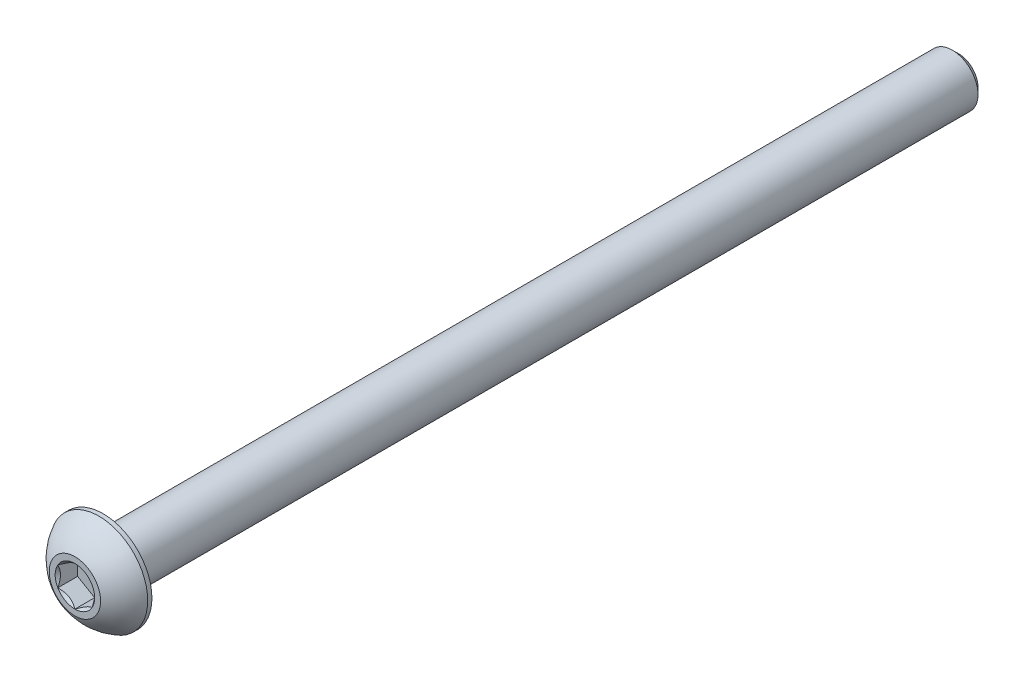
ISO-10303-21;
HEADER;
FILE_DESCRIPTION(('STEP AP214'),'2;1');
FILE_NAME('part.step','',(''),(''),'','','');
FILE_SCHEMA(('AUTOMOTIVE_DESIGN { 1 0 10303 214 1 1 1 1 }'));
ENDSEC;
DATA;
#1=APPLICATION_CONTEXT('core data for automotive mechanical design processes');
#2=APPLICATION_PROTOCOL_DEFINITION('international standard','automotive_design',2000,#1);
#3=PRODUCT_CONTEXT('',#1,'mechanical');
#4=PRODUCT('Part','Part','',(#3));
#5=PRODUCT_RELATED_PRODUCT_CATEGORY('part','',(#4));
#6=PRODUCT_DEFINITION_FORMATION('','',#4);
#7=PRODUCT_DEFINITION_CONTEXT('part definition',#1,'design');
#8=PRODUCT_DEFINITION('design','',#6,#7);
#9=PRODUCT_DEFINITION_SHAPE('','',#8);
#10=(LENGTH_UNIT() NAMED_UNIT(*) SI_UNIT(.MILLI.,.METRE.));
#11=(NAMED_UNIT(*) PLANE_ANGLE_UNIT() SI_UNIT($,.RADIAN.));
#12=(NAMED_UNIT(*) SI_UNIT($,.STERADIAN.) SOLID_ANGLE_UNIT());
#13=UNCERTAINTY_MEASURE_WITH_UNIT(LENGTH_MEASURE(1.E-05),#10,'distance_accuracy_value','');
#14=(GEOMETRIC_REPRESENTATION_CONTEXT(3) GLOBAL_UNCERTAINTY_ASSIGNED_CONTEXT((#13)) GLOBAL_UNIT_ASSIGNED_CONTEXT((#10,
#11,#12)) REPRESENTATION_CONTEXT('',''));
#15=CARTESIAN_POINT('',(0.,0.,0.));
#16=DIRECTION('',(0.,0.,1.));
#17=DIRECTION('',(1.,0.,0.));
#18=AXIS2_PLACEMENT_3D('',#15,#16,#17);
#19=CARTESIAN_POINT('',(0.,0.,-51.65));
#20=DIRECTION('',(0.,0.,1.));
#21=DIRECTION('',(1.,0.,0.));
#22=AXIS2_PLACEMENT_3D('',#19,#20,#21);
#23=PLANE('',#22);
#24=CARTESIAN_POINT('',(0.,0.,-51.65));
#25=DIRECTION('',(0.,0.,1.));
#26=DIRECTION('',(1.,0.,0.));
#27=AXIS2_PLACEMENT_3D('',#24,#25,#26);
#28=CIRCLE('',#27,1.12500000000003);
#29=CARTESIAN_POINT('',(1.12500000000003,0.,-51.65));
#30=VERTEX_POINT('',#29);
#31=EDGE_CURVE('E55',#30,#30,#28,.T.);
#32=ORIENTED_EDGE('',*,*,#31,.F.);
#33=EDGE_LOOP('',(#32));
#34=FACE_BOUND('',#33,.T.);
#35=ADVANCED_FACE('F41',(#34),#23,.F.);
#36=CARTESIAN_POINT('',(0.,0.,-51.65));
#37=DIRECTION('',(0.,0.,1.));
#38=DIRECTION('',(1.,0.,0.));
#39=AXIS2_PLACEMENT_3D('',#36,#37,#38);
#40=CONICAL_SURFACE('',#39,1.12500000000003,0.785398163397431);
#41=CARTESIAN_POINT('',(0.,0.,-51.275));
#42=DIRECTION('',(0.,0.,1.));
#43=DIRECTION('',(1.,0.,0.));
#44=AXIS2_PLACEMENT_3D('',#41,#42,#43);
#45=CIRCLE('',#44,1.50000000000002);
#46=CARTESIAN_POINT('',(1.50000000000002,0.,-51.275));
#47=VERTEX_POINT('',#46);
#48=EDGE_CURVE('E198',#47,#47,#45,.T.);
#49=ORIENTED_EDGE('',*,*,#48,.F.);
#50=EDGE_LOOP('',(#49));
#51=FACE_BOUND('',#50,.T.);
#52=ORIENTED_EDGE('',*,*,#31,.T.);
#53=EDGE_LOOP('',(#52));
#54=FACE_BOUND('',#53,.T.);
#55=ADVANCED_FACE('F205',(#51,#54),#40,.T.);
#56=CARTESIAN_POINT('',(0.,0.,0.));
#57=DIRECTION('',(0.,0.,1.));
#58=DIRECTION('',(1.,0.,0.));
#59=AXIS2_PLACEMENT_3D('',#56,#57,#58);
#60=CYLINDRICAL_SURFACE('',#59,1.50000000000002);
#61=CARTESIAN_POINT('',(0.,0.,-1.65));
#62=DIRECTION('',(0.,0.,1.));
#63=DIRECTION('',(1.,0.,0.));
#64=AXIS2_PLACEMENT_3D('',#61,#62,#63);
#65=CIRCLE('',#64,1.50000000000002);
#66=CARTESIAN_POINT('',(1.50000000000002,0.,-1.65));
#67=VERTEX_POINT('',#66);
#68=EDGE_CURVE('E194',#67,#67,#65,.T.);
#69=ORIENTED_EDGE('',*,*,#68,.F.);
#70=EDGE_LOOP('',(#69));
#71=FACE_BOUND('',#70,.T.);
#72=ORIENTED_EDGE('',*,*,#48,.T.);
#73=EDGE_LOOP('',(#72));
#74=FACE_BOUND('',#73,.T.);
#75=ADVANCED_FACE('F211',(#71,#74),#60,.T.);
#76=CARTESIAN_POINT('',(0.,-2.85,-1.65));
#77=DIRECTION('',(0.,0.,1.));
#78=DIRECTION('',(1.,0.,0.));
#79=AXIS2_PLACEMENT_3D('',#76,#77,#78);
#80=PLANE('',#79);
#81=CARTESIAN_POINT('',(0.,0.,-1.65));
#82=DIRECTION('',(0.,0.,1.));
#83=DIRECTION('',(1.,0.,0.));
#84=AXIS2_PLACEMENT_3D('',#81,#82,#83);
#85=CIRCLE('',#84,2.85);
#86=CARTESIAN_POINT('',(2.85,0.,-1.65));
#87=VERTEX_POINT('',#86);
#88=EDGE_CURVE('E186',#87,#87,#85,.T.);
#89=ORIENTED_EDGE('',*,*,#88,.F.);
#90=EDGE_LOOP('',(#89));
#91=FACE_BOUND('',#90,.T.);
#92=ORIENTED_EDGE('',*,*,#68,.T.);
#93=EDGE_LOOP('',(#92));
#94=FACE_BOUND('',#93,.T.);
#95=ADVANCED_FACE('F216',(#91,#94),#80,.F.);
#96=CARTESIAN_POINT('',(0.,0.,-2.79483288770053));
#97=DIRECTION('',(0.,0.,1.));
#98=DIRECTION('',(0.,-1.,0.));
#99=AXIS2_PLACEMENT_3D('',#96,#97,#98);
#100=SPHERICAL_SURFACE('',#99,3.17192226735975);
#101=CARTESIAN_POINT('',(0.,0.,0.));
#102=DIRECTION('',(0.,0.,1.));
#103=DIRECTION('',(1.,0.,0.));
#104=AXIS2_PLACEMENT_3D('',#101,#102,#103);
#105=CIRCLE('',#104,1.50000000000002);
#106=CARTESIAN_POINT('',(0.,-1.50000000000002,0.));
#107=VERTEX_POINT('',#106);
#108=EDGE_CURVE('E190',#107,#107,#105,.T.);
#109=CARTESIAN_POINT('',(0.,0.,-1.4025));
#110=DIRECTION('',(0.,0.,1.));
#111=DIRECTION('',(1.,0.,0.));
#112=AXIS2_PLACEMENT_3D('',#109,#110,#111);
#113=CIRCLE('',#112,2.85);
#114=CARTESIAN_POINT('',(0.,-2.85,-1.4025));
#115=VERTEX_POINT('',#114);
#116=EDGE_CURVE('E182',#115,#115,#113,.T.);
#117=CARTESIAN_POINT('',(0.,-1.50000000000002,0.));
#118=CARTESIAN_POINT('',(0.,-1.51816007989212,-0.009746569473365));
#119=CARTESIAN_POINT('',(0.,-1.53622513742982,-0.0196701847238474));
#120=CARTESIAN_POINT('',(0.,-1.57215840256596,-0.039867631129312));
#121=CARTESIAN_POINT('',(0.,-1.59002661016439,-0.0501414622842942));
#122=CARTESIAN_POINT('',(0.,-1.62555937019151,-0.0710354648490238));
#123=CARTESIAN_POINT('',(0.,-1.64322392262021,-0.0816556362587711));
#124=CARTESIAN_POINT('',(0.,-1.67834266450263,-0.103238276426968));
#125=CARTESIAN_POINT('',(0.,-1.69579685395637,-0.114200745185417));
#126=CARTESIAN_POINT('',(0.,-1.73048823664555,-0.136463816635607));
#127=CARTESIAN_POINT('',(0.,-1.747725429881,-0.147764419327348));
#128=CARTESIAN_POINT('',(0.,-1.78197627078177,-0.170699464187154));
#129=CARTESIAN_POINT('',(0.,-1.7989899184471,-0.18233390635522));
#130=CARTESIAN_POINT('',(0.,-1.83278720341136,-0.205932209546913));
#131=CARTESIAN_POINT('',(0.,-1.84957084071029,-0.217896070570541));
#132=CARTESIAN_POINT('',(0.,-1.88290172764637,-0.242148665498755));
#133=CARTESIAN_POINT('',(0.,-1.89944897728351,-0.254437399403342));
#134=CARTESIAN_POINT('',(0.,-1.9323008013937,-0.279335070725424));
#135=CARTESIAN_POINT('',(0.,-1.94860537586674,-0.291944008142921));
#136=CARTESIAN_POINT('',(0.,-1.98096565436366,-0.317477295441113));
#137=CARTESIAN_POINT('',(0.,-1.99702135838754,-0.330401645321808));
#138=CARTESIAN_POINT('',(0.,-2.02887779526297,-0.356560846652227));
#139=CARTESIAN_POINT('',(0.,-2.04467852811453,-0.36979569810195));
#140=CARTESIAN_POINT('',(0.,-2.07601901880465,-0.396570873693308));
#141=CARTESIAN_POINT('',(0.,-2.09155877664322,-0.410111197834944));
#142=CARTESIAN_POINT('',(0.,-2.12237141262986,-0.437492173862107));
#143=CARTESIAN_POINT('',(0.,-2.13764429077792,-0.451332825747635));
#144=CARTESIAN_POINT('',(0.,-2.16791736411296,-0.479309198198269));
#145=CARTESIAN_POINT('',(0.,-2.18291755929994,-0.493444918763376));
#146=CARTESIAN_POINT('',(0.,-2.21263956705415,-0.522006057390952));
#147=CARTESIAN_POINT('',(0.,-2.2273613796214,-0.53643147545342));
#148=CARTESIAN_POINT('',(0.,-2.25652102825521,-0.565566527816472));
#149=CARTESIAN_POINT('',(0.,-2.27095886432178,-0.580276162117056));
#150=CARTESIAN_POINT('',(0.,-2.2995450739765,-0.609974057702796));
#151=CARTESIAN_POINT('',(0.,-2.31369344756466,-0.624962318987953));
#152=CARTESIAN_POINT('',(0.,-2.34169535627252,-0.65521177341876));
#153=CARTESIAN_POINT('',(0.,-2.35554889139224,-0.670472966564411));
#154=CARTESIAN_POINT('',(0.,-2.38295585920366,-0.701262485885584));
#155=CARTESIAN_POINT('',(0.,-2.39650929189537,-0.716790812061106));
#156=CARTESIAN_POINT('',(0.,-2.42331090492182,-0.748108697108243));
#157=CARTESIAN_POINT('',(0.,-2.43655908525657,-0.763898255979859));
#158=CARTESIAN_POINT('',(0.,-2.46274515962755,-0.795732606824228));
#159=CARTESIAN_POINT('',(0.,-2.47568305366379,-0.811777398796981));
#160=CARTESIAN_POINT('',(0.,-2.50124363939651,-0.844116119267127));
#161=CARTESIAN_POINT('',(0.,-2.51386633109298,-0.86041004776452));
#162=CARTESIAN_POINT('',(0.,-2.53879171587279,-0.8932408500426));
#163=CARTESIAN_POINT('',(0.,-2.55109440895612,-0.909777723823287));
#164=CARTESIAN_POINT('',(0.,-2.57537512182785,-0.94308813311364));
#165=CARTESIAN_POINT('',(0.,-2.58735314161625,-0.959861668623306));
#166=CARTESIAN_POINT('',(0.,-2.61097995657956,-0.993639027894247));
#167=CARTESIAN_POINT('',(0.,-2.62262875175448,-1.01064285165552));
#168=CARTESIAN_POINT('',(0.,-2.64559269128199,-1.04487432644225));
#169=CARTESIAN_POINT('',(0.,-2.65690783563458,-1.06210197746771));
#170=CARTESIAN_POINT('',(0.,-2.67920017403639,-1.09677456077299));
#171=CARTESIAN_POINT('',(0.,-2.69017736808561,-1.11421949305282));
#172=CARTESIAN_POINT('',(0.,-2.711789634999,-1.14932001019995));
#173=CARTESIAN_POINT('',(0.,-2.72242470786316,-1.16697559506725));
#174=CARTESIAN_POINT('',(0.,-2.74334869082118,-1.20249070903943));
#175=CARTESIAN_POINT('',(0.,-2.75363760091502,-1.22035023814429));
#176=CARTESIAN_POINT('',(0.,-2.77386535089241,-1.25626645340824));
#177=CARTESIAN_POINT('',(0.,-2.78380419077596,-1.27432313956732));
#178=CARTESIAN_POINT('',(0.,-2.80332801615778,-1.31062681184411));
#179=CARTESIAN_POINT('',(0.,-2.81291300165605,-1.32887379796182));
#180=CARTESIAN_POINT('',(0.,-2.83172550494215,-1.3655511220839));
#181=CARTESIAN_POINT('',(0.,-2.84095302272998,-1.38398146008827));
#182=CARTESIAN_POINT('',(0.,-2.85,-1.4025));
#183=B_SPLINE_CURVE_WITH_KNOTS('',3,(#117,#118,#119,#120,#121,#122,#123,#124,#125,#126,#127,
#128,#129,#130,#131,#132,#133,#134,#135,#136,#137,#138,#139,#140,#141,#142,#143,#144,#145,#146,
#147,#148,#149,#150,#151,#152,#153,#154,#155,#156,#157,#158,#159,#160,#161,#162,#163,#164,#165,
#166,#167,#168,#169,#170,#171,#172,#173,#174,#175,#176,#177,#178,#179,#180,#181,#182),
.UNSPECIFIED.,.F.,.F.,(4,2,2,2,2,2,2,2,2,2,2,2,2,2,2,2,2,2,2,2,2,2,2,2,2,2,2,2,2,2,2,2,4),(0.,
0.061829894182698,0.123659788365395,0.185489682548094,0.247319576730792,0.30914947091349,
0.370979365096188,0.432809259278885,0.494639153461583,0.556469047644282,0.618298941826979,
0.680128836009677,0.741958730192375,0.803788624375073,0.865618518557771,0.927448412740469,
0.989278306923166,1.05110820110586,1.11293809528856,1.17476798947126,1.23659788365396,
1.29842777783666,1.36025767201935,1.42208756620205,1.48391746038475,1.54574735456745,
1.60757724875015,1.66940714293284,1.73123703711554,1.79306693129824,1.85489682548094,
1.91672671966364,1.97855661384633),.UNSPECIFIED.);
#184=EDGE_CURVE('BSEAM221',#107,#115,#183,.T.);
#185=ORIENTED_EDGE('',*,*,#108,.F.);
#186=ORIENTED_EDGE('',*,*,#116,.T.);
#187=ORIENTED_EDGE('',*,*,#184,.T.);
#188=ORIENTED_EDGE('',*,*,#184,.F.);
#189=EDGE_LOOP('',(#185,#187,#186,#188));
#190=FACE_BOUND('',#189,.T.);
#191=ADVANCED_FACE('F221',(#190),#100,.T.);
#192=CARTESIAN_POINT('',(0.,-1.50000000000002,0.));
#193=DIRECTION('',(0.,0.,-1.));
#194=DIRECTION('',(-1.,0.,0.));
#195=AXIS2_PLACEMENT_3D('',#192,#193,#194);
#196=PLANE('',#195);
#197=CARTESIAN_POINT('',(0.,0.,0.));
#198=DIRECTION('',(0.,0.,1.));
#199=DIRECTION('',(1.,0.,0.));
#200=AXIS2_PLACEMENT_3D('',#197,#198,#199);
#201=CIRCLE('',#200,1.15470053837925);
#202=CARTESIAN_POINT('',(-0.999999999999997,0.577350269189625,0.));
#203=VERTEX_POINT('',#202);
#204=CARTESIAN_POINT('',(-0.999999999999997,-0.577350269189627,0.));
#205=VERTEX_POINT('',#204);
#206=EDGE_CURVE('E68',#203,#205,#201,.T.);
#207=ORIENTED_EDGE('',*,*,#206,.F.);
#208=CARTESIAN_POINT('',(0.,1.15470053837925,0.));
#209=VERTEX_POINT('',#208);
#210=EDGE_CURVE('E145',#209,#203,#201,.T.);
#211=ORIENTED_EDGE('',*,*,#210,.F.);
#212=CARTESIAN_POINT('',(1.,0.57735026918962,0.));
#213=VERTEX_POINT('',#212);
#214=EDGE_CURVE('E140',#213,#209,#201,.T.);
#215=ORIENTED_EDGE('',*,*,#214,.F.);
#216=CARTESIAN_POINT('',(1.,-0.577350269189621,0.));
#217=VERTEX_POINT('',#216);
#218=EDGE_CURVE('E109',#217,#213,#201,.T.);
#219=ORIENTED_EDGE('',*,*,#218,.F.);
#220=CARTESIAN_POINT('',(0.,-1.15470053837925,0.));
#221=VERTEX_POINT('',#220);
#222=EDGE_CURVE('E100',#221,#217,#201,.T.);
#223=ORIENTED_EDGE('',*,*,#222,.F.);
#224=EDGE_CURVE('E61',#205,#221,#201,.T.);
#225=ORIENTED_EDGE('',*,*,#224,.F.);
#226=EDGE_LOOP('',(#207,#211,#215,#219,#223,#225));
#227=FACE_BOUND('',#226,.T.);
#228=ORIENTED_EDGE('',*,*,#108,.T.);
#229=EDGE_LOOP('',(#228));
#230=FACE_BOUND('',#229,.T.);
#231=ADVANCED_FACE('F137',(#227,#230),#196,.F.);
#232=CARTESIAN_POINT('',(0.,0.,0.));
#233=DIRECTION('',(0.,0.,1.));
#234=DIRECTION('',(1.,0.,0.));
#235=AXIS2_PLACEMENT_3D('',#232,#233,#234);
#236=CYLINDRICAL_SURFACE('',#235,2.85);
#237=ORIENTED_EDGE('',*,*,#116,.F.);
#238=EDGE_LOOP('',(#237));
#239=FACE_BOUND('',#238,.T.);
#240=ORIENTED_EDGE('',*,*,#88,.T.);
#241=EDGE_LOOP('',(#240));
#242=FACE_BOUND('',#241,.T.);
#243=ADVANCED_FACE('F227',(#239,#242),#236,.T.);
#244=CARTESIAN_POINT('',(0.,0.,0.));
#245=DIRECTION('',(0.,0.,1.));
#246=DIRECTION('',(1.,0.,0.));
#247=AXIS2_PLACEMENT_3D('',#244,#245,#246);
#248=CONICAL_SURFACE('',#247,1.15470053837925,0.78539816339745);
#249=ORIENTED_EDGE('',*,*,#218,.T.);
#250=CARTESIAN_POINT('',(1.,-1.15147208646461,0.370385677513857));
#251=CARTESIAN_POINT('',(1.,-1.12343447988551,0.349219919873708));
#252=CARTESIAN_POINT('',(1.,-1.09524064850696,0.328261692175906));
#253=CARTESIAN_POINT('',(1.,-1.03847715644375,0.286846022235618));
#254=CARTESIAN_POINT('',(1.,-1.00990740382974,0.266388706123655));
#255=CARTESIAN_POINT('',(1.,-0.92312089433347,0.205604794954506));
#256=CARTESIAN_POINT('',(1.,-0.864253173759053,0.166192228961395));
#257=CARTESIAN_POINT('',(1.,-0.74080985825804,0.0888206642002037));
#258=CARTESIAN_POINT('',(1.,-0.676100255137802,0.0510730391143415));
#259=CARTESIAN_POINT('',(1.,-0.54344893904912,-0.0179754124487081));
#260=CARTESIAN_POINT('',(1.,-0.475519112027775,-0.049297972153134));
#261=CARTESIAN_POINT('',(1.,-0.373555850333526,-0.0876182211162039));
#262=CARTESIAN_POINT('',(1.,-0.341031989670905,-0.0986164083578424));
#263=CARTESIAN_POINT('',(1.,-0.275199079052291,-0.118001657852638));
#264=CARTESIAN_POINT('',(1.,-0.24188997517393,-0.126388540223299));
#265=CARTESIAN_POINT('',(1.,-0.17524751704299,-0.139974779280982));
#266=CARTESIAN_POINT('',(1.,-0.141925568218173,-0.145229209232031));
#267=CARTESIAN_POINT('',(1.,-0.0749144362322771,-0.152451313429106));
#268=CARTESIAN_POINT('',(1.,-0.0412251978501601,-0.15441848638949));
#269=CARTESIAN_POINT('',(1.,0.0249580992634224,-0.154916801606837));
#270=CARTESIAN_POINT('',(1.,0.0574512826460405,-0.153569732111363));
#271=CARTESIAN_POINT('',(1.,0.122148505701868,-0.147783515501013));
#272=CARTESIAN_POINT('',(1.,0.154352610132927,-0.143345079338462));
#273=CARTESIAN_POINT('',(1.,0.21879989886764,-0.131543169854794));
#274=CARTESIAN_POINT('',(1.,0.251033743268954,-0.124129458961488));
#275=CARTESIAN_POINT('',(1.,0.314797132354919,-0.106771057501322));
#276=CARTESIAN_POINT('',(1.,0.346326735731005,-0.0968265787111677));
#277=CARTESIAN_POINT('',(1.,0.445594187730205,-0.0617765174456608));
#278=CARTESIAN_POINT('',(1.,0.511919139476036,-0.0326791416432731));
#279=CARTESIAN_POINT('',(1.,0.641453244657532,0.0320153296865072));
#280=CARTESIAN_POINT('',(1.,0.704650133126345,0.0676357767152442));
#281=CARTESIAN_POINT('',(1.,0.825428490174987,0.141123901346938));
#282=CARTESIAN_POINT('',(1.,0.883132947867685,0.178791947135466));
#283=CARTESIAN_POINT('',(1.,0.968148853704565,0.237022852943166));
#284=CARTESIAN_POINT('',(1.,0.996120570380285,0.256638475762859));
#285=CARTESIAN_POINT('',(1.,1.05168177729901,0.296388517061273));
#286=CARTESIAN_POINT('',(1.,1.079271369977,0.316522792198834));
#287=CARTESIAN_POINT('',(1.,1.10670185346329,0.336872119072974));
#288=B_SPLINE_CURVE_WITH_KNOTS('',3,(#250,#251,#252,#253,#254,#255,#256,#257,#258,#259,#260,
#261,#262,#263,#264,#265,#266,#267,#268,#269,#270,#271,#272,#273,#274,#275,#276,#277,#278,#279,
#280,#281,#282,#283,#284,#285,#286,#287),.UNSPECIFIED.,.F.,.F.,(4,2,2,2,2,2,2,2,2,2,2,2,2,2,2,2,
2,2,4),(0.,0.10538645908329,0.210799187330123,0.423233611565466,0.647793540908498,
0.871580877738603,0.974493074181413,1.077412358272,1.17846428203204,1.27953161415761,
1.37694086739609,1.47432772585407,1.57343322804292,1.6725304397285,1.88917353996826,
2.10660791038812,2.31323734249842,2.41572589232043,2.51818641476502),.UNSPECIFIED.);
#289=EDGE_CURVE('E11',#217,#213,#288,.T.);
#290=ORIENTED_EDGE('',*,*,#289,.F.);
#291=EDGE_LOOP('',(#249,#290));
#292=FACE_BOUND('',#291,.T.);
#293=ADVANCED_FACE('F113',(#292),#248,.F.);
#294=ORIENTED_EDGE('',*,*,#214,.T.);
#295=CARTESIAN_POINT('',(1.0002,0.577234799135786,0.000115487372616175));
#296=CARTESIAN_POINT('',(0.96581740499282,0.59708559961862,-0.0197220691742649));
#297=CARTESIAN_POINT('',(0.930859881860175,0.617268335009455,-0.0383949793611092));
#298=CARTESIAN_POINT('',(0.85957719704391,0.658423412276684,-0.0725852572768405));
#299=CARTESIAN_POINT('',(0.823245249471016,0.679399671988078,-0.0880835909765399));
#300=CARTESIAN_POINT('',(0.749983386196688,0.721697428470845,-0.114632692857734));
#301=CARTESIAN_POINT('',(0.713072148554585,0.743008141459635,-0.125750226003073));
#302=CARTESIAN_POINT('',(0.63843727068914,0.786098608286185,-0.142880134223817));
#303=CARTESIAN_POINT('',(0.600715911891363,0.80787704494228,-0.148905302533326));
#304=CARTESIAN_POINT('',(0.535707801582065,0.845409494928862,-0.154339445032505));
#305=CARTESIAN_POINT('',(0.508505628471827,0.8611146768966,-0.155143061683267));
#306=CARTESIAN_POINT('',(0.454153959330887,0.892494627706028,-0.153793300583112));
#307=CARTESIAN_POINT('',(0.427004476245123,0.908169389073952,-0.1516392704528));
#308=CARTESIAN_POINT('',(0.345943722673039,0.954969836969509,-0.140883027871528));
#309=CARTESIAN_POINT('',(0.292435859021572,0.985862616452446,-0.127985443584643));
#310=CARTESIAN_POINT('',(0.198523934856568,1.04008269114923,-0.0968592693978221));
#311=CARTESIAN_POINT('',(0.157679476328165,1.0636642502755,-0.0802622022981601));
#312=CARTESIAN_POINT('',(0.0775903626180563,1.10990372163519,-0.042875075314707));
#313=CARTESIAN_POINT('',(0.0383409891295625,1.1325643579843,-0.0220986581825966));
#314=CARTESIAN_POINT('',(-0.000199999999999514,1.15481600843309,0.000115487372613833));
#315=B_SPLINE_CURVE_WITH_KNOTS('',3,(#295,#296,#297,#298,#299,#300,#301,#302,#303,#304,#305,
#306,#307,#308,#309,#310,#311,#312,#313,#314),.UNSPECIFIED.,.F.,.F.,(4,2,2,2,2,2,2,2,2,4),(0.,
0.13323767682856,0.267252229834491,0.399137076269302,0.53068960328077,0.624814864263848,
0.718960890149135,0.907306626112099,1.05710100361789,1.20641411519286),.UNSPECIFIED.);
#316=EDGE_CURVE('E144',#213,#209,#315,.T.);
#317=ORIENTED_EDGE('',*,*,#316,.F.);
#318=EDGE_LOOP('',(#294,#317));
#319=FACE_BOUND('',#318,.T.);
#320=ADVANCED_FACE('F323',(#319),#248,.F.);
#321=ORIENTED_EDGE('',*,*,#210,.T.);
#322=CARTESIAN_POINT('',(0.000200000000000433,1.15481600843309,0.000115487372613877));
#323=CARTESIAN_POINT('',(-0.0341825950071802,1.13496520795025,-0.019722069174267));
#324=CARTESIAN_POINT('',(-0.0691401181398243,1.11478247255942,-0.0383949793611112));
#325=CARTESIAN_POINT('',(-0.140422802956089,1.07362739529219,-0.0725852572768422));
#326=CARTESIAN_POINT('',(-0.176754750528983,1.0526511355808,-0.0880835909765415));
#327=CARTESIAN_POINT('',(-0.25001661380331,1.01035337909803,-0.114632692857735));
#328=CARTESIAN_POINT('',(-0.286927851445413,0.989042666109238,-0.125750226003074));
#329=CARTESIAN_POINT('',(-0.361562729310858,0.945952199282689,-0.142880134223818));
#330=CARTESIAN_POINT('',(-0.399284088108635,0.924173762626594,-0.148905302533327));
#331=CARTESIAN_POINT('',(-0.464292198417932,0.886641312640012,-0.154339445032506));
#332=CARTESIAN_POINT('',(-0.491494371528171,0.870936130672273,-0.155143061683268));
#333=CARTESIAN_POINT('',(-0.54584604066911,0.839556179862846,-0.153793300583113));
#334=CARTESIAN_POINT('',(-0.572995523754874,0.823881418494921,-0.151639270452801));
#335=CARTESIAN_POINT('',(-0.654056277326958,0.777080970599365,-0.140883027871529));
#336=CARTESIAN_POINT('',(-0.707564140978425,0.746188191116428,-0.127985443584644));
#337=CARTESIAN_POINT('',(-0.801476065143429,0.691968116419648,-0.096859269397823));
#338=CARTESIAN_POINT('',(-0.842320523671832,0.66838655729337,-0.080262202298161));
#339=CARTESIAN_POINT('',(-0.922409637381941,0.62214708593368,-0.0428750753147078));
#340=CARTESIAN_POINT('',(-0.961659010870435,0.599486449584574,-0.0220986581825973));
#341=CARTESIAN_POINT('',(-1.0002,0.577234799135787,0.00011548737261326));
#342=B_SPLINE_CURVE_WITH_KNOTS('',3,(#322,#323,#324,#325,#326,#327,#328,#329,#330,#331,#332,
#333,#334,#335,#336,#337,#338,#339,#340,#341),.UNSPECIFIED.,.F.,.F.,(4,2,2,2,2,2,2,2,2,4),(0.,
0.133237676828559,0.26725222983449,0.399137076269299,0.530689603280767,0.624814864263845,
0.718960890149132,0.907306626112096,1.05710100361789,1.20641411519286),.UNSPECIFIED.);
#343=EDGE_CURVE('E151',#209,#203,#342,.T.);
#344=ORIENTED_EDGE('',*,*,#343,.F.);
#345=EDGE_LOOP('',(#321,#344));
#346=FACE_BOUND('',#345,.T.);
#347=ADVANCED_FACE('F156',(#346),#248,.F.);
#348=ORIENTED_EDGE('',*,*,#206,.T.);
#349=CARTESIAN_POINT('',(-0.999999999999996,-1.15147208646461,0.370385677513859));
#350=CARTESIAN_POINT('',(-0.999999999999996,-1.12343447988552,0.34921991987371));
#351=CARTESIAN_POINT('',(-0.999999999999996,-1.09524064850697,0.328261692175907));
#352=CARTESIAN_POINT('',(-0.999999999999996,-1.03847715644376,0.286846022235619));
#353=CARTESIAN_POINT('',(-0.999999999999996,-1.00990740382975,0.266388706123656));
#354=CARTESIAN_POINT('',(-0.999999999999996,-0.923120894333474,0.205604794954507));
#355=CARTESIAN_POINT('',(-0.999999999999997,-0.864253173759057,0.166192228961396));
#356=CARTESIAN_POINT('',(-0.999999999999997,-0.740809858258044,0.0888206642002033));
#357=CARTESIAN_POINT('',(-0.999999999999997,-0.676100255137805,0.0510730391143406));
#358=CARTESIAN_POINT('',(-0.999999999999997,-0.543448939049123,-0.0179754124487097));
#359=CARTESIAN_POINT('',(-0.999999999999997,-0.475519112027777,-0.049297972153136));
#360=CARTESIAN_POINT('',(-0.999999999999997,-0.373555850333528,-0.0876182211162064));
#361=CARTESIAN_POINT('',(-0.999999999999997,-0.341031989670907,-0.098616408357845));
#362=CARTESIAN_POINT('',(-0.999999999999997,-0.275199079052293,-0.118001657852641));
#363=CARTESIAN_POINT('',(-0.999999999999997,-0.241889975173932,-0.126388540223302));
#364=CARTESIAN_POINT('',(-0.999999999999997,-0.175247517042992,-0.139974779280985));
#365=CARTESIAN_POINT('',(-0.999999999999997,-0.141925568218175,-0.145229209232034));
#366=CARTESIAN_POINT('',(-0.999999999999997,-0.0749144362322791,-0.152451313429109));
#367=CARTESIAN_POINT('',(-0.999999999999997,-0.041225197850162,-0.154418486389493));
#368=CARTESIAN_POINT('',(-0.999999999999997,0.0249580992634205,-0.15491680160684));
#369=CARTESIAN_POINT('',(-0.999999999999997,0.0574512826460387,-0.153569732111367));
#370=CARTESIAN_POINT('',(-0.999999999999997,0.122148505701866,-0.147783515501016));
#371=CARTESIAN_POINT('',(-0.999999999999997,0.154352610132926,-0.143345079338466));
#372=CARTESIAN_POINT('',(-0.999999999999997,0.218799898867639,-0.131543169854798));
#373=CARTESIAN_POINT('',(-0.999999999999997,0.251033743268952,-0.124129458961492));
#374=CARTESIAN_POINT('',(-0.999999999999997,0.314797132354917,-0.106771057501326));
#375=CARTESIAN_POINT('',(-0.999999999999997,0.346326735731003,-0.0968265787111716));
#376=CARTESIAN_POINT('',(-0.999999999999997,0.445594187730203,-0.0617765174456648));
#377=CARTESIAN_POINT('',(-0.999999999999997,0.511919139476034,-0.0326791416432772));
#378=CARTESIAN_POINT('',(-0.999999999999997,0.641453244657529,0.0320153296865026));
#379=CARTESIAN_POINT('',(-0.999999999999997,0.704650133126341,0.0676357767152392));
#380=CARTESIAN_POINT('',(-0.999999999999997,0.825428490174983,0.141123901346932));
#381=CARTESIAN_POINT('',(-0.999999999999997,0.883132947867681,0.17879194713546));
#382=CARTESIAN_POINT('',(-0.999999999999997,0.968148853704561,0.23702285294316));
#383=CARTESIAN_POINT('',(-0.999999999999997,0.99612057038028,0.256638475762853));
#384=CARTESIAN_POINT('',(-0.999999999999997,1.05168177729901,0.296388517061267));
#385=CARTESIAN_POINT('',(-0.999999999999997,1.079271369977,0.316522792198828));
#386=CARTESIAN_POINT('',(-0.999999999999997,1.10670185346329,0.336872119072968));
#387=B_SPLINE_CURVE_WITH_KNOTS('',3,(#349,#350,#351,#352,#353,#354,#355,#356,#357,#358,#359,
#360,#361,#362,#363,#364,#365,#366,#367,#368,#369,#370,#371,#372,#373,#374,#375,#376,#377,#378,
#379,#380,#381,#382,#383,#384,#385,#386),.UNSPECIFIED.,.F.,.F.,(4,2,2,2,2,2,2,2,2,2,2,2,2,2,2,2,
2,2,4),(0.,0.10538645908329,0.210799187330124,0.423233611565468,0.647793540908502,
0.871580877738608,0.974493074181418,1.07741235827201,1.17846428203204,1.27953161415762,
1.3769408673961,1.47432772585407,1.57343322804293,1.67253043972851,1.88917353996827,
2.10660791038812,2.31323734249843,2.41572589232044,2.51818641476502),.UNSPECIFIED.);
#388=EDGE_CURVE('E161',#203,#205,#387,.F.);
#389=ORIENTED_EDGE('',*,*,#388,.F.);
#390=EDGE_LOOP('',(#348,#389));
#391=FACE_BOUND('',#390,.T.);
#392=ADVANCED_FACE('F317',(#391),#248,.F.);
#393=ORIENTED_EDGE('',*,*,#224,.T.);
#394=CARTESIAN_POINT('',(-1.0002,-0.577234799135786,0.000115487372612706));
#395=CARTESIAN_POINT('',(-0.965817404992816,-0.59708559961862,-0.0197220691742684));
#396=CARTESIAN_POINT('',(-0.930859881860172,-0.617268335009454,-0.0383949793611125));
#397=CARTESIAN_POINT('',(-0.859577197043907,-0.658423412276684,-0.0725852572768433));
#398=CARTESIAN_POINT('',(-0.823245249471013,-0.679399671988078,-0.0880835909765424));
#399=CARTESIAN_POINT('',(-0.749983386196686,-0.721697428470844,-0.114632692857736));
#400=CARTESIAN_POINT('',(-0.713072148554583,-0.743008141459635,-0.125750226003075));
#401=CARTESIAN_POINT('',(-0.638437270689138,-0.786098608286184,-0.142880134223819));
#402=CARTESIAN_POINT('',(-0.600715911891361,-0.807877044942279,-0.148905302533328));
#403=CARTESIAN_POINT('',(-0.535707801582064,-0.84540949492886,-0.154339445032507));
#404=CARTESIAN_POINT('',(-0.508505628471825,-0.861114676896599,-0.155143061683269));
#405=CARTESIAN_POINT('',(-0.454153959330885,-0.892494627706026,-0.153793300583114));
#406=CARTESIAN_POINT('',(-0.427004476245122,-0.908169389073951,-0.151639270452802));
#407=CARTESIAN_POINT('',(-0.345943722673037,-0.954969836969508,-0.14088302787153));
#408=CARTESIAN_POINT('',(-0.29243585902157,-0.985862616452444,-0.127985443584645));
#409=CARTESIAN_POINT('',(-0.198523934856567,-1.04008269114922,-0.0968592693978238));
#410=CARTESIAN_POINT('',(-0.157679476328164,-1.0636642502755,-0.0802622022981617));
#411=CARTESIAN_POINT('',(-0.0775903626180547,-1.10990372163519,-0.0428750753147082));
#412=CARTESIAN_POINT('',(-0.0383409891295607,-1.1325643579843,-0.0220986581825977));
#413=CARTESIAN_POINT('',(0.000200000000001427,-1.15481600843309,0.000115487372612954));
#414=B_SPLINE_CURVE_WITH_KNOTS('',3,(#394,#395,#396,#397,#398,#399,#400,#401,#402,#403,#404,
#405,#406,#407,#408,#409,#410,#411,#412,#413),.UNSPECIFIED.,.F.,.F.,(4,2,2,2,2,2,2,2,2,4),(0.,
0.133237676828559,0.26725222983449,0.399137076269299,0.530689603280767,0.624814864263845,
0.718960890149132,0.907306626112096,1.05710100361789,1.20641411519286),.UNSPECIFIED.);
#415=EDGE_CURVE('E126',#205,#221,#414,.T.);
#416=ORIENTED_EDGE('',*,*,#415,.F.);
#417=EDGE_LOOP('',(#393,#416));
#418=FACE_BOUND('',#417,.T.);
#419=ADVANCED_FACE('F256',(#418),#248,.F.);
#420=ORIENTED_EDGE('',*,*,#222,.T.);
#421=CARTESIAN_POINT('',(-0.000199999999998591,-1.15481600843309,0.00011548737261301));
#422=CARTESIAN_POINT('',(0.0341825950071819,-1.13496520795025,-0.0197220691742678));
#423=CARTESIAN_POINT('',(0.0691401181398259,-1.11478247255942,-0.0383949793611118));
#424=CARTESIAN_POINT('',(0.14042280295609,-1.07362739529219,-0.0725852572768426));
#425=CARTESIAN_POINT('',(0.176754750528985,-1.05265113558079,-0.0880835909765418));
#426=CARTESIAN_POINT('',(0.250016613803312,-1.01035337909803,-0.114632692857735));
#427=CARTESIAN_POINT('',(0.286927851445415,-0.989042666109238,-0.125750226003074));
#428=CARTESIAN_POINT('',(0.361562729310859,-0.945952199282688,-0.142880134223818));
#429=CARTESIAN_POINT('',(0.399284088108636,-0.924173762626594,-0.148905302533327));
#430=CARTESIAN_POINT('',(0.464292198417933,-0.886641312640012,-0.154339445032506));
#431=CARTESIAN_POINT('',(0.491494371528172,-0.870936130672273,-0.155143061683268));
#432=CARTESIAN_POINT('',(0.545846040669111,-0.839556179862846,-0.153793300583113));
#433=CARTESIAN_POINT('',(0.572995523754875,-0.823881418494921,-0.151639270452801));
#434=CARTESIAN_POINT('',(0.654056277326959,-0.777080970599364,-0.140883027871529));
#435=CARTESIAN_POINT('',(0.707564140978426,-0.746188191116428,-0.127985443584645));
#436=CARTESIAN_POINT('',(0.801476065143431,-0.691968116419647,-0.0968592693978229));
#437=CARTESIAN_POINT('',(0.842320523671833,-0.668386557293369,-0.0802622022981606));
#438=CARTESIAN_POINT('',(0.922409637381943,-0.622147085933678,-0.0428750753147068));
#439=CARTESIAN_POINT('',(0.961659010870437,-0.599486449584572,-0.022098658182596));
#440=CARTESIAN_POINT('',(1.0002,-0.577234799135784,0.00011548737261471));
#441=B_SPLINE_CURVE_WITH_KNOTS('',3,(#421,#422,#423,#424,#425,#426,#427,#428,#429,#430,#431,
#432,#433,#434,#435,#436,#437,#438,#439,#440),.UNSPECIFIED.,.F.,.F.,(4,2,2,2,2,2,2,2,2,4),(0.,
0.133237676828559,0.267252229834489,0.399137076269299,0.530689603280766,0.624814864263844,
0.71896089014913,0.907306626112094,1.05710100361789,1.20641411519286),.UNSPECIFIED.);
#442=EDGE_CURVE('E104',#221,#217,#441,.T.);
#443=ORIENTED_EDGE('',*,*,#442,.F.);
#444=EDGE_LOOP('',(#420,#443));
#445=FACE_BOUND('',#444,.T.);
#446=ADVANCED_FACE('F102',(#445),#248,.F.);
#447=CARTESIAN_POINT('',(1.,-0.577350269189622,-1.155));
#448=DIRECTION('',(0.,0.,1.));
#449=DIRECTION('',(1.,0.,0.));
#450=AXIS2_PLACEMENT_3D('',#447,#448,#449);
#451=PLANE('',#450);
#452=DIRECTION('',(0.866025403784438,0.5,0.));
#453=VECTOR('',#452,1.);
#454=CARTESIAN_POINT('',(0.,-1.15470053837925,-1.155));
#455=LINE('',#454,#453);
#456=CARTESIAN_POINT('',(0.,-1.15470053837925,-1.155));
#457=VERTEX_POINT('',#456);
#458=CARTESIAN_POINT('',(1.,-0.577350269189622,-1.155));
#459=VERTEX_POINT('',#458);
#460=EDGE_CURVE('E125',#457,#459,#455,.T.);
#461=ORIENTED_EDGE('',*,*,#460,.T.);
#462=DIRECTION('',(0.,1.,0.));
#463=VECTOR('',#462,1.);
#464=CARTESIAN_POINT('',(1.,-0.577350269189622,-1.155));
#465=LINE('',#464,#463);
#466=CARTESIAN_POINT('',(1.,0.577350269189624,-1.155));
#467=VERTEX_POINT('',#466);
#468=EDGE_CURVE('E130',#459,#467,#465,.T.);
#469=ORIENTED_EDGE('',*,*,#468,.T.);
#470=DIRECTION('',(-0.866025403784439,0.499999999999999,0.));
#471=VECTOR('',#470,1.);
#472=CARTESIAN_POINT('',(1.,0.577350269189624,-1.155));
#473=LINE('',#472,#471);
#474=CARTESIAN_POINT('',(0.,1.15470053837925,-1.155));
#475=VERTEX_POINT('',#474);
#476=EDGE_CURVE('E301',#467,#475,#473,.T.);
#477=ORIENTED_EDGE('',*,*,#476,.T.);
#478=DIRECTION('',(-0.866025403784439,-0.5,0.));
#479=VECTOR('',#478,1.);
#480=CARTESIAN_POINT('',(0.,1.15470053837925,-1.155));
#481=LINE('',#480,#479);
#482=CARTESIAN_POINT('',(-0.999999999999997,0.577350269189625,-1.155));
#483=VERTEX_POINT('',#482);
#484=EDGE_CURVE('E170',#475,#483,#481,.T.);
#485=ORIENTED_EDGE('',*,*,#484,.T.);
#486=DIRECTION('',(0.,-1.,0.));
#487=VECTOR('',#486,1.);
#488=CARTESIAN_POINT('',(-0.999999999999997,0.577350269189625,-1.155));
#489=LINE('',#488,#487);
#490=CARTESIAN_POINT('',(-0.999999999999997,-0.577350269189624,-1.155));
#491=VERTEX_POINT('',#490);
#492=EDGE_CURVE('E307',#483,#491,#489,.T.);
#493=ORIENTED_EDGE('',*,*,#492,.T.);
#494=DIRECTION('',(0.866025403784439,-0.5,0.));
#495=VECTOR('',#494,1.);
#496=CARTESIAN_POINT('',(-0.999999999999997,-0.577350269189624,-1.155));
#497=LINE('',#496,#495);
#498=EDGE_CURVE('E134',#491,#457,#497,.T.);
#499=ORIENTED_EDGE('',*,*,#498,.T.);
#500=EDGE_LOOP('',(#461,#469,#477,#485,#493,#499));
#501=FACE_BOUND('',#500,.T.);
#502=ADVANCED_FACE('F255',(#501),#451,.T.);
#503=CARTESIAN_POINT('',(1.,-0.577350269189622,-1.155));
#504=DIRECTION('',(1.,0.,0.));
#505=DIRECTION('',(0.,1.,0.));
#506=AXIS2_PLACEMENT_3D('',#503,#504,#505);
#507=PLANE('',#506);
#508=DIRECTION('',(0.,0.,1.));
#509=VECTOR('',#508,1.);
#510=CARTESIAN_POINT('',(1.,-0.577350269189622,-1.155));
#511=LINE('',#510,#509);
#512=EDGE_CURVE('E121',#459,#217,#511,.T.);
#513=ORIENTED_EDGE('',*,*,#512,.T.);
#514=ORIENTED_EDGE('',*,*,#289,.T.);
#515=DIRECTION('',(0.,0.,1.));
#516=VECTOR('',#515,1.);
#517=CARTESIAN_POINT('',(1.,0.577350269189624,-1.155));
#518=LINE('',#517,#516);
#519=EDGE_CURVE('E133',#467,#213,#518,.T.);
#520=ORIENTED_EDGE('',*,*,#519,.F.);
#521=ORIENTED_EDGE('',*,*,#468,.F.);
#522=EDGE_LOOP('',(#513,#514,#520,#521));
#523=FACE_BOUND('',#522,.T.);
#524=ADVANCED_FACE('F128',(#523),#507,.F.);
#525=CARTESIAN_POINT('',(1.,0.577350269189624,-1.155));
#526=DIRECTION('',(0.499999999999999,0.866025403784439,0.));
#527=DIRECTION('',(-0.866025403784439,0.499999999999999,0.));
#528=AXIS2_PLACEMENT_3D('',#525,#526,#527);
#529=PLANE('',#528);
#530=ORIENTED_EDGE('',*,*,#519,.T.);
#531=ORIENTED_EDGE('',*,*,#316,.T.);
#532=DIRECTION('',(0.,0.,1.));
#533=VECTOR('',#532,1.);
#534=CARTESIAN_POINT('',(0.,1.15470053837925,-1.155));
#535=LINE('',#534,#533);
#536=EDGE_CURVE('E166',#475,#209,#535,.T.);
#537=ORIENTED_EDGE('',*,*,#536,.F.);
#538=ORIENTED_EDGE('',*,*,#476,.F.);
#539=EDGE_LOOP('',(#530,#531,#537,#538));
#540=FACE_BOUND('',#539,.T.);
#541=ADVANCED_FACE('F164',(#540),#529,.F.);
#542=CARTESIAN_POINT('',(0.,1.15470053837925,-1.155));
#543=DIRECTION('',(-0.5,0.866025403784439,0.));
#544=DIRECTION('',(-0.866025403784439,-0.5,0.));
#545=AXIS2_PLACEMENT_3D('',#542,#543,#544);
#546=PLANE('',#545);
#547=ORIENTED_EDGE('',*,*,#536,.T.);
#548=ORIENTED_EDGE('',*,*,#343,.T.);
#549=DIRECTION('',(0.,0.,1.));
#550=VECTOR('',#549,1.);
#551=CARTESIAN_POINT('',(-0.999999999999997,0.577350269189625,-1.155));
#552=LINE('',#551,#550);
#553=EDGE_CURVE('E173',#483,#203,#552,.T.);
#554=ORIENTED_EDGE('',*,*,#553,.F.);
#555=ORIENTED_EDGE('',*,*,#484,.F.);
#556=EDGE_LOOP('',(#547,#548,#554,#555));
#557=FACE_BOUND('',#556,.T.);
#558=ADVANCED_FACE('F168',(#557),#546,.F.);
#559=CARTESIAN_POINT('',(-0.999999999999997,0.577350269189625,-1.155));
#560=DIRECTION('',(-1.,0.,0.));
#561=DIRECTION('',(0.,-1.,0.));
#562=AXIS2_PLACEMENT_3D('',#559,#560,#561);
#563=PLANE('',#562);
#564=ORIENTED_EDGE('',*,*,#553,.T.);
#565=ORIENTED_EDGE('',*,*,#388,.T.);
#566=DIRECTION('',(0.,0.,1.));
#567=VECTOR('',#566,1.);
#568=CARTESIAN_POINT('',(-0.999999999999997,-0.577350269189624,-1.155));
#569=LINE('',#568,#567);
#570=EDGE_CURVE('E177',#491,#205,#569,.T.);
#571=ORIENTED_EDGE('',*,*,#570,.F.);
#572=ORIENTED_EDGE('',*,*,#492,.F.);
#573=EDGE_LOOP('',(#564,#565,#571,#572));
#574=FACE_BOUND('',#573,.T.);
#575=ADVANCED_FACE('F278',(#574),#563,.F.);
#576=CARTESIAN_POINT('',(-0.999999999999997,-0.577350269189624,-1.155));
#577=DIRECTION('',(-0.5,-0.866025403784439,0.));
#578=DIRECTION('',(0.866025403784439,-0.5,0.));
#579=AXIS2_PLACEMENT_3D('',#576,#577,#578);
#580=PLANE('',#579);
#581=ORIENTED_EDGE('',*,*,#570,.T.);
#582=ORIENTED_EDGE('',*,*,#415,.T.);
#583=DIRECTION('',(0.,0.,1.));
#584=VECTOR('',#583,1.);
#585=CARTESIAN_POINT('',(0.,-1.15470053837925,-1.155));
#586=LINE('',#585,#584);
#587=EDGE_CURVE('E123',#457,#221,#586,.T.);
#588=ORIENTED_EDGE('',*,*,#587,.F.);
#589=ORIENTED_EDGE('',*,*,#498,.F.);
#590=EDGE_LOOP('',(#581,#582,#588,#589));
#591=FACE_BOUND('',#590,.T.);
#592=ADVANCED_FACE('F236',(#591),#580,.F.);
#593=CARTESIAN_POINT('',(0.,-1.15470053837925,-1.155));
#594=DIRECTION('',(0.500000000000001,-0.866025403784438,0.));
#595=DIRECTION('',(0.866025403784438,0.500000000000001,0.));
#596=AXIS2_PLACEMENT_3D('',#593,#594,#595);
#597=PLANE('',#596);
#598=ORIENTED_EDGE('',*,*,#587,.T.);
#599=ORIENTED_EDGE('',*,*,#442,.T.);
#600=ORIENTED_EDGE('',*,*,#512,.F.);
#601=ORIENTED_EDGE('',*,*,#460,.F.);
#602=EDGE_LOOP('',(#598,#599,#600,#601));
#603=FACE_BOUND('',#602,.T.);
#604=ADVANCED_FACE('F119',(#603),#597,.F.);
#605=CLOSED_SHELL('',(#35,#55,#75,#95,#191,#231,#243,#293,#320,#347,#392,#419,#446,#502,#524,
#541,#558,#575,#592,#604));
#606=MANIFOLD_SOLID_BREP('B2',#605);
#607=ADVANCED_BREP_SHAPE_REPRESENTATION('',(#18,#606),#14);
#608=SHAPE_DEFINITION_REPRESENTATION(#9,#607);
ENDSEC;
END-ISO-10303-21;
